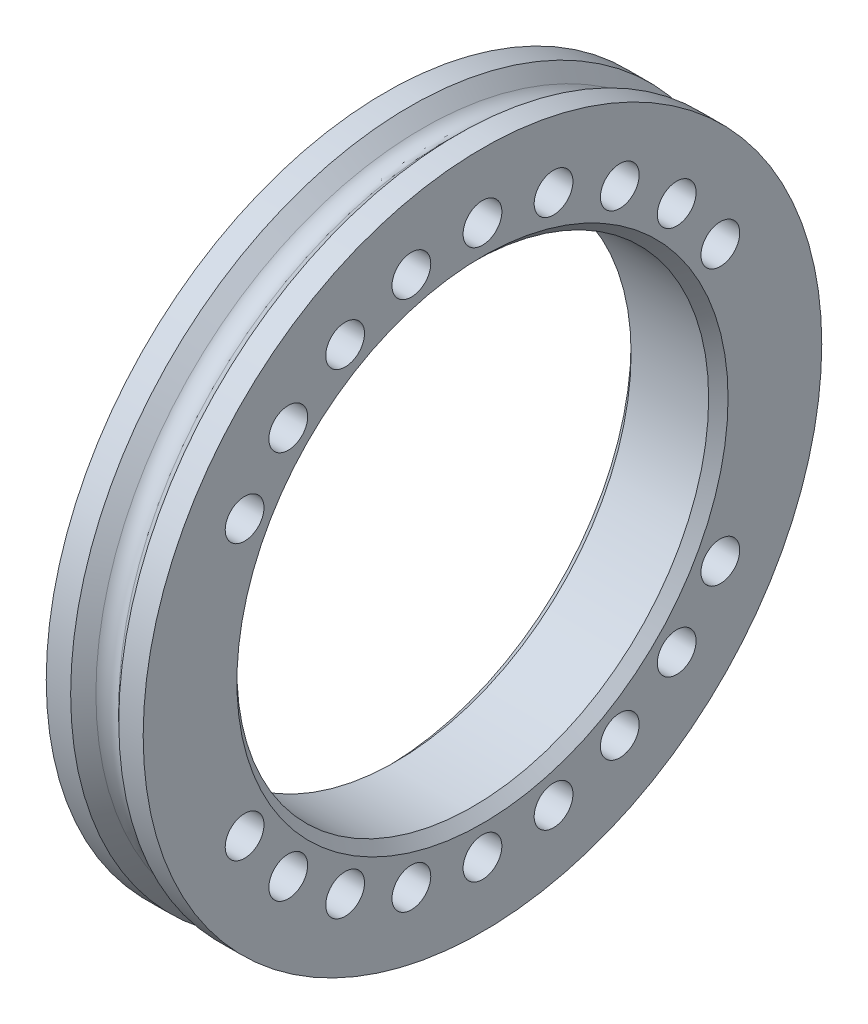
ISO-10303-21;
HEADER;
FILE_DESCRIPTION(('STEP AP214'),'2;1');
FILE_NAME('part.step','',(''),(''),'','','');
FILE_SCHEMA(('AUTOMOTIVE_DESIGN { 1 0 10303 214 1 1 1 1 }'));
ENDSEC;
DATA;
#1=APPLICATION_CONTEXT('core data for automotive mechanical design processes');
#2=APPLICATION_PROTOCOL_DEFINITION('international standard','automotive_design',2000,#1);
#3=PRODUCT_CONTEXT('',#1,'mechanical');
#4=PRODUCT('Part','Part','',(#3));
#5=PRODUCT_RELATED_PRODUCT_CATEGORY('part','',(#4));
#6=PRODUCT_DEFINITION_FORMATION('','',#4);
#7=PRODUCT_DEFINITION_CONTEXT('part definition',#1,'design');
#8=PRODUCT_DEFINITION('design','',#6,#7);
#9=PRODUCT_DEFINITION_SHAPE('','',#8);
#10=(LENGTH_UNIT() NAMED_UNIT(*) SI_UNIT(.MILLI.,.METRE.));
#11=(NAMED_UNIT(*) PLANE_ANGLE_UNIT() SI_UNIT($,.RADIAN.));
#12=(NAMED_UNIT(*) SI_UNIT($,.STERADIAN.) SOLID_ANGLE_UNIT());
#13=UNCERTAINTY_MEASURE_WITH_UNIT(LENGTH_MEASURE(1.E-05),#10,'distance_accuracy_value','');
#14=(GEOMETRIC_REPRESENTATION_CONTEXT(3) GLOBAL_UNCERTAINTY_ASSIGNED_CONTEXT((#13)) GLOBAL_UNIT_ASSIGNED_CONTEXT((#10,
#11,#12)) REPRESENTATION_CONTEXT('',''));
#15=CARTESIAN_POINT('',(0.,0.,0.));
#16=DIRECTION('',(0.,0.,1.));
#17=DIRECTION('',(1.,0.,0.));
#18=AXIS2_PLACEMENT_3D('',#15,#16,#17);
#19=CARTESIAN_POINT('',(-7.4423881554251,0.,0.));
#20=DIRECTION('',(-1.,0.,0.));
#21=DIRECTION('',(0.,0.,1.));
#22=AXIS2_PLACEMENT_3D('',#19,#20,#21);
#23=CONICAL_SURFACE('',#22,105.,0.785398163397449);
#24=CARTESIAN_POINT('',(-3.53553390593271,0.,0.));
#25=DIRECTION('',(1.,0.,0.));
#26=DIRECTION('',(0.,0.,-1.));
#27=AXIS2_PLACEMENT_3D('',#24,#25,#26);
#28=CIRCLE('',#27,101.093145750508);
#29=CARTESIAN_POINT('',(-3.53553390593271,0.,-101.093145750508));
#30=VERTEX_POINT('',#29);
#31=EDGE_CURVE('E39',#30,#30,#28,.F.);
#32=ORIENTED_EDGE('',*,*,#31,.T.);
#33=EDGE_LOOP('',(#32));
#34=FACE_BOUND('',#33,.T.);
#35=CARTESIAN_POINT('',(-7.4423881554251,0.,0.));
#36=DIRECTION('',(-1.,0.,0.));
#37=DIRECTION('',(0.,0.,1.));
#38=AXIS2_PLACEMENT_3D('',#35,#36,#37);
#39=CIRCLE('',#38,105.);
#40=CARTESIAN_POINT('',(-7.4423881554251,0.,105.));
#41=VERTEX_POINT('',#40);
#42=EDGE_CURVE('E58',#41,#41,#39,.T.);
#43=ORIENTED_EDGE('',*,*,#42,.F.);
#44=EDGE_LOOP('',(#43));
#45=FACE_BOUND('',#44,.T.);
#46=ADVANCED_FACE('F32',(#34,#45),#23,.T.);
#47=CARTESIAN_POINT('',(0.,0.,0.));
#48=DIRECTION('',(-1.,0.,0.));
#49=DIRECTION('',(0.,0.,1.));
#50=AXIS2_PLACEMENT_3D('',#47,#48,#49);
#51=CYLINDRICAL_SURFACE('',#50,105.);
#52=CARTESIAN_POINT('',(-15.,0.,0.));
#53=DIRECTION('',(-1.,0.,0.));
#54=DIRECTION('',(0.,0.,1.));
#55=AXIS2_PLACEMENT_3D('',#52,#53,#54);
#56=CIRCLE('',#55,105.);
#57=CARTESIAN_POINT('',(-15.,0.,105.));
#58=VERTEX_POINT('',#57);
#59=EDGE_CURVE('E61',#58,#58,#56,.T.);
#60=ORIENTED_EDGE('',*,*,#59,.F.);
#61=EDGE_LOOP('',(#60));
#62=FACE_BOUND('',#61,.T.);
#63=ORIENTED_EDGE('',*,*,#42,.T.);
#64=EDGE_LOOP('',(#63));
#65=FACE_BOUND('',#64,.T.);
#66=ADVANCED_FACE('F186',(#62,#65),#51,.T.);
#67=CARTESIAN_POINT('',(-15.,0.,0.));
#68=DIRECTION('',(1.,0.,0.));
#69=DIRECTION('',(0.,0.,-1.));
#70=AXIS2_PLACEMENT_3D('',#67,#68,#69);
#71=PLANE('',#70);
#72=CARTESIAN_POINT('',(-15.,-42.4999999999998,73.6121593216774));
#73=DIRECTION('',(-1.,0.,0.));
#74=DIRECTION('',(0.,-0.86602540378444,-0.499999999999998));
#75=AXIS2_PLACEMENT_3D('',#72,#73,#74);
#76=CIRCLE('',#75,6.);
#77=CARTESIAN_POINT('',(-15.,-47.6961524227065,70.6121593216774));
#78=VERTEX_POINT('',#77);
#79=EDGE_CURVE('E134',#78,#78,#76,.T.);
#80=ORIENTED_EDGE('',*,*,#79,.F.);
#81=EDGE_LOOP('',(#80));
#82=FACE_BOUND('',#81,.T.);
#83=CARTESIAN_POINT('',(-15.,-60.1040764008564,60.1040764008567));
#84=DIRECTION('',(-1.,0.,0.));
#85=DIRECTION('',(0.,-0.707106781186549,-0.707106781186546));
#86=AXIS2_PLACEMENT_3D('',#83,#84,#85);
#87=CIRCLE('',#86,6.);
#88=CARTESIAN_POINT('',(-15.,-64.3467170879757,55.8614357137374));
#89=VERTEX_POINT('',#88);
#90=EDGE_CURVE('E140',#89,#89,#87,.T.);
#91=ORIENTED_EDGE('',*,*,#90,.F.);
#92=EDGE_LOOP('',(#91));
#93=FACE_BOUND('',#92,.T.);
#94=CARTESIAN_POINT('',(-15.,-73.6121593216773,42.5000000000001));
#95=DIRECTION('',(-1.,0.,0.));
#96=DIRECTION('',(0.,-0.500000000000001,-0.866025403784438));
#97=AXIS2_PLACEMENT_3D('',#94,#95,#96);
#98=CIRCLE('',#97,6.);
#99=CARTESIAN_POINT('',(-15.,-76.6121593216773,37.3038475772935));
#100=VERTEX_POINT('',#99);
#101=EDGE_CURVE('E146',#100,#100,#98,.T.);
#102=ORIENTED_EDGE('',*,*,#101,.F.);
#103=EDGE_LOOP('',(#102));
#104=FACE_BOUND('',#103,.T.);
#105=CARTESIAN_POINT('',(-15.,-82.1036952345708,21.9996188337143));
#106=DIRECTION('',(-1.,0.,0.));
#107=DIRECTION('',(0.,-0.258819045102521,-0.965925826289068));
#108=AXIS2_PLACEMENT_3D('',#105,#106,#107);
#109=CIRCLE('',#108,6.);
#110=CARTESIAN_POINT('',(-15.,-83.6566095051859,16.2040638759799));
#111=VERTEX_POINT('',#110);
#112=EDGE_CURVE('E152',#111,#111,#109,.T.);
#113=ORIENTED_EDGE('',*,*,#112,.F.);
#114=EDGE_LOOP('',(#113));
#115=FACE_BOUND('',#114,.T.);
#116=CARTESIAN_POINT('',(-15.,-42.4999999999998,-73.6121593216774));
#117=DIRECTION('',(-1.,0.,0.));
#118=DIRECTION('',(0.,0.86602540378444,-0.499999999999998));
#119=AXIS2_PLACEMENT_3D('',#116,#117,#118);
#120=CIRCLE('',#119,6.);
#121=CARTESIAN_POINT('',(-15.,-37.3038475772932,-76.6121593216774));
#122=VERTEX_POINT('',#121);
#123=EDGE_CURVE('E158',#122,#122,#120,.T.);
#124=ORIENTED_EDGE('',*,*,#123,.F.);
#125=EDGE_LOOP('',(#124));
#126=FACE_BOUND('',#125,.T.);
#127=CARTESIAN_POINT('',(-15.,-60.1040764008564,-60.1040764008567));
#128=DIRECTION('',(-1.,0.,0.));
#129=DIRECTION('',(0.,0.707106781186549,-0.707106781186546));
#130=AXIS2_PLACEMENT_3D('',#127,#128,#129);
#131=CIRCLE('',#130,6.);
#132=CARTESIAN_POINT('',(-15.,-55.8614357137372,-64.3467170879759));
#133=VERTEX_POINT('',#132);
#134=EDGE_CURVE('E164',#133,#133,#131,.T.);
#135=ORIENTED_EDGE('',*,*,#134,.F.);
#136=EDGE_LOOP('',(#135));
#137=FACE_BOUND('',#136,.T.);
#138=CARTESIAN_POINT('',(-15.,-73.6121593216773,-42.5000000000001));
#139=DIRECTION('',(-1.,0.,0.));
#140=DIRECTION('',(0.,0.500000000000001,-0.866025403784438));
#141=AXIS2_PLACEMENT_3D('',#138,#139,#140);
#142=CIRCLE('',#141,6.);
#143=CARTESIAN_POINT('',(-15.,-70.6121593216773,-47.6961524227067));
#144=VERTEX_POINT('',#143);
#145=EDGE_CURVE('E170',#144,#144,#142,.T.);
#146=ORIENTED_EDGE('',*,*,#145,.F.);
#147=EDGE_LOOP('',(#146));
#148=FACE_BOUND('',#147,.T.);
#149=CARTESIAN_POINT('',(-15.,-82.1036952345708,-21.9996188337143));
#150=DIRECTION('',(-1.,0.,0.));
#151=DIRECTION('',(0.,0.258819045102521,-0.965925826289068));
#152=AXIS2_PLACEMENT_3D('',#149,#150,#151);
#153=CIRCLE('',#152,6.);
#154=CARTESIAN_POINT('',(-15.,-80.5507809639557,-27.7951737914487));
#155=VERTEX_POINT('',#154);
#156=EDGE_CURVE('E128',#155,#155,#153,.T.);
#157=ORIENTED_EDGE('',*,*,#156,.F.);
#158=EDGE_LOOP('',(#157));
#159=FACE_BOUND('',#158,.T.);
#160=CARTESIAN_POINT('',(-15.,-85.,0.));
#161=DIRECTION('',(-1.,0.,0.));
#162=DIRECTION('',(0.,0.,-1.));
#163=AXIS2_PLACEMENT_3D('',#160,#161,#162);
#164=CIRCLE('',#163,6.);
#165=CARTESIAN_POINT('',(-15.,-85.,-6.));
#166=VERTEX_POINT('',#165);
#167=EDGE_CURVE('E87',#166,#166,#164,.T.);
#168=ORIENTED_EDGE('',*,*,#167,.F.);
#169=EDGE_LOOP('',(#168));
#170=FACE_BOUND('',#169,.T.);
#171=CARTESIAN_POINT('',(-15.,42.4999999999998,73.6121593216774));
#172=DIRECTION('',(1.,0.,0.));
#173=DIRECTION('',(0.,0.86602540378444,-0.499999999999998));
#174=AXIS2_PLACEMENT_3D('',#171,#172,#173);
#175=CIRCLE('',#174,6.);
#176=CARTESIAN_POINT('',(-15.,47.6961524227065,70.6121593216774));
#177=VERTEX_POINT('',#176);
#178=EDGE_CURVE('E86',#177,#177,#175,.T.);
#179=ORIENTED_EDGE('',*,*,#178,.T.);
#180=EDGE_LOOP('',(#179));
#181=FACE_BOUND('',#180,.T.);
#182=CARTESIAN_POINT('',(-15.,60.1040764008564,60.1040764008567));
#183=DIRECTION('',(1.,0.,0.));
#184=DIRECTION('',(0.,0.707106781186549,-0.707106781186546));
#185=AXIS2_PLACEMENT_3D('',#182,#183,#184);
#186=CIRCLE('',#185,6.);
#187=CARTESIAN_POINT('',(-15.,64.3467170879757,55.8614357137374));
#188=VERTEX_POINT('',#187);
#189=EDGE_CURVE('E93',#188,#188,#186,.T.);
#190=ORIENTED_EDGE('',*,*,#189,.T.);
#191=EDGE_LOOP('',(#190));
#192=FACE_BOUND('',#191,.T.);
#193=CARTESIAN_POINT('',(-15.,73.6121593216773,42.5000000000001));
#194=DIRECTION('',(1.,0.,0.));
#195=DIRECTION('',(0.,0.500000000000001,-0.866025403784438));
#196=AXIS2_PLACEMENT_3D('',#193,#194,#195);
#197=CIRCLE('',#196,6.);
#198=CARTESIAN_POINT('',(-15.,76.6121593216773,37.3038475772935));
#199=VERTEX_POINT('',#198);
#200=EDGE_CURVE('E99',#199,#199,#197,.T.);
#201=ORIENTED_EDGE('',*,*,#200,.T.);
#202=EDGE_LOOP('',(#201));
#203=FACE_BOUND('',#202,.T.);
#204=CARTESIAN_POINT('',(-15.,73.6121593216773,-42.5000000000001));
#205=DIRECTION('',(1.,0.,0.));
#206=DIRECTION('',(0.,-0.500000000000001,-0.866025403784438));
#207=AXIS2_PLACEMENT_3D('',#204,#205,#206);
#208=CIRCLE('',#207,6.);
#209=CARTESIAN_POINT('',(-15.,70.6121593216773,-47.6961524227067));
#210=VERTEX_POINT('',#209);
#211=EDGE_CURVE('E80',#210,#210,#208,.T.);
#212=ORIENTED_EDGE('',*,*,#211,.T.);
#213=EDGE_LOOP('',(#212));
#214=FACE_BOUND('',#213,.T.);
#215=CARTESIAN_POINT('',(-15.,60.1040764008564,-60.1040764008567));
#216=DIRECTION('',(1.,0.,0.));
#217=DIRECTION('',(0.,-0.707106781186549,-0.707106781186546));
#218=AXIS2_PLACEMENT_3D('',#215,#216,#217);
#219=CIRCLE('',#218,6.);
#220=CARTESIAN_POINT('',(-15.,55.8614357137372,-64.3467170879759));
#221=VERTEX_POINT('',#220);
#222=EDGE_CURVE('E106',#221,#221,#219,.T.);
#223=ORIENTED_EDGE('',*,*,#222,.T.);
#224=EDGE_LOOP('',(#223));
#225=FACE_BOUND('',#224,.T.);
#226=CARTESIAN_POINT('',(-15.,42.4999999999998,-73.6121593216774));
#227=DIRECTION('',(1.,0.,0.));
#228=DIRECTION('',(0.,-0.86602540378444,-0.499999999999998));
#229=AXIS2_PLACEMENT_3D('',#226,#227,#228);
#230=CIRCLE('',#229,6.);
#231=CARTESIAN_POINT('',(-15.,37.3038475772932,-76.6121593216774));
#232=VERTEX_POINT('',#231);
#233=EDGE_CURVE('E107',#232,#232,#230,.T.);
#234=ORIENTED_EDGE('',*,*,#233,.T.);
#235=EDGE_LOOP('',(#234));
#236=FACE_BOUND('',#235,.T.);
#237=CARTESIAN_POINT('',(-15.,82.1036952345708,21.9996188337143));
#238=DIRECTION('',(1.,0.,0.));
#239=DIRECTION('',(0.,0.258819045102521,-0.965925826289068));
#240=AXIS2_PLACEMENT_3D('',#237,#238,#239);
#241=CIRCLE('',#240,6.);
#242=CARTESIAN_POINT('',(-15.,83.6566095051859,16.2040638759799));
#243=VERTEX_POINT('',#242);
#244=EDGE_CURVE('E117',#243,#243,#241,.T.);
#245=ORIENTED_EDGE('',*,*,#244,.T.);
#246=EDGE_LOOP('',(#245));
#247=FACE_BOUND('',#246,.T.);
#248=CARTESIAN_POINT('',(-15.,82.1036952345708,-21.9996188337143));
#249=DIRECTION('',(1.,0.,0.));
#250=DIRECTION('',(0.,-0.258819045102521,-0.965925826289068));
#251=AXIS2_PLACEMENT_3D('',#248,#249,#250);
#252=CIRCLE('',#251,6.);
#253=CARTESIAN_POINT('',(-15.,80.5507809639557,-27.7951737914487));
#254=VERTEX_POINT('',#253);
#255=EDGE_CURVE('E74',#254,#254,#252,.T.);
#256=ORIENTED_EDGE('',*,*,#255,.T.);
#257=EDGE_LOOP('',(#256));
#258=FACE_BOUND('',#257,.T.);
#259=CARTESIAN_POINT('',(-15.,85.,0.));
#260=DIRECTION('',(1.,0.,0.));
#261=DIRECTION('',(0.,0.,-1.));
#262=AXIS2_PLACEMENT_3D('',#259,#260,#261);
#263=CIRCLE('',#262,6.);
#264=CARTESIAN_POINT('',(-15.,85.,-6.));
#265=VERTEX_POINT('',#264);
#266=EDGE_CURVE('E70',#265,#265,#263,.T.);
#267=ORIENTED_EDGE('',*,*,#266,.T.);
#268=EDGE_LOOP('',(#267));
#269=FACE_BOUND('',#268,.T.);
#270=CARTESIAN_POINT('',(-15.,0.,0.));
#271=DIRECTION('',(1.,0.,0.));
#272=DIRECTION('',(0.,0.,-1.));
#273=AXIS2_PLACEMENT_3D('',#270,#271,#272);
#274=CIRCLE('',#273,76.);
#275=CARTESIAN_POINT('',(-15.,0.,-76.));
#276=VERTEX_POINT('',#275);
#277=EDGE_CURVE('E43',#276,#276,#274,.T.);
#278=ORIENTED_EDGE('',*,*,#277,.T.);
#279=EDGE_LOOP('',(#278));
#280=FACE_BOUND('',#279,.T.);
#281=ORIENTED_EDGE('',*,*,#59,.T.);
#282=EDGE_LOOP('',(#281));
#283=FACE_BOUND('',#282,.T.);
#284=ADVANCED_FACE('F182',(#82,#93,#104,#115,#126,#137,#148,#159,#170,#181,#192,#203,#214,#225,
#236,#247,#258,#269,#280,#283),#71,.F.);
#285=CARTESIAN_POINT('',(0.,0.,0.));
#286=DIRECTION('',(-1.,0.,0.));
#287=DIRECTION('',(0.,0.,1.));
#288=AXIS2_PLACEMENT_3D('',#285,#286,#287);
#289=CYLINDRICAL_SURFACE('',#288,73.);
#290=CARTESIAN_POINT('',(12.,0.,0.));
#291=DIRECTION('',(1.,0.,0.));
#292=DIRECTION('',(0.,0.,-1.));
#293=AXIS2_PLACEMENT_3D('',#290,#291,#292);
#294=CIRCLE('',#293,73.);
#295=CARTESIAN_POINT('',(12.,0.,-73.));
#296=VERTEX_POINT('',#295);
#297=EDGE_CURVE('E47',#296,#296,#294,.T.);
#298=ORIENTED_EDGE('',*,*,#297,.T.);
#299=EDGE_LOOP('',(#298));
#300=FACE_BOUND('',#299,.T.);
#301=CARTESIAN_POINT('',(-11.9999999999999,0.,0.));
#302=DIRECTION('',(1.,0.,0.));
#303=DIRECTION('',(0.,0.,-1.));
#304=AXIS2_PLACEMENT_3D('',#301,#302,#303);
#305=CIRCLE('',#304,73.);
#306=CARTESIAN_POINT('',(-11.9999999999999,0.,-73.));
#307=VERTEX_POINT('',#306);
#308=EDGE_CURVE('E52',#307,#307,#305,.F.);
#309=ORIENTED_EDGE('',*,*,#308,.T.);
#310=EDGE_LOOP('',(#309));
#311=FACE_BOUND('',#310,.T.);
#312=ADVANCED_FACE('F185',(#300,#311),#289,.F.);
#313=CARTESIAN_POINT('',(15.,0.,0.));
#314=DIRECTION('',(1.,0.,0.));
#315=DIRECTION('',(0.,0.,-1.));
#316=AXIS2_PLACEMENT_3D('',#313,#314,#315);
#317=PLANE('',#316);
#318=CARTESIAN_POINT('',(15.,-42.4999999999998,73.6121593216774));
#319=DIRECTION('',(-1.,0.,0.));
#320=DIRECTION('',(0.,-0.86602540378444,-0.499999999999998));
#321=AXIS2_PLACEMENT_3D('',#318,#319,#320);
#322=CIRCLE('',#321,6.);
#323=CARTESIAN_POINT('',(15.,-47.6961524227065,70.6121593216774));
#324=VERTEX_POINT('',#323);
#325=EDGE_CURVE('E131',#324,#324,#322,.T.);
#326=ORIENTED_EDGE('',*,*,#325,.T.);
#327=EDGE_LOOP('',(#326));
#328=FACE_BOUND('',#327,.T.);
#329=CARTESIAN_POINT('',(15.,-60.1040764008564,60.1040764008567));
#330=DIRECTION('',(-1.,0.,0.));
#331=DIRECTION('',(0.,-0.707106781186549,-0.707106781186546));
#332=AXIS2_PLACEMENT_3D('',#329,#330,#331);
#333=CIRCLE('',#332,6.);
#334=CARTESIAN_POINT('',(15.,-64.3467170879757,55.8614357137374));
#335=VERTEX_POINT('',#334);
#336=EDGE_CURVE('E137',#335,#335,#333,.T.);
#337=ORIENTED_EDGE('',*,*,#336,.T.);
#338=EDGE_LOOP('',(#337));
#339=FACE_BOUND('',#338,.T.);
#340=CARTESIAN_POINT('',(15.,-73.6121593216773,42.5000000000001));
#341=DIRECTION('',(-1.,0.,0.));
#342=DIRECTION('',(0.,-0.500000000000001,-0.866025403784438));
#343=AXIS2_PLACEMENT_3D('',#340,#341,#342);
#344=CIRCLE('',#343,6.);
#345=CARTESIAN_POINT('',(15.,-76.6121593216773,37.3038475772935));
#346=VERTEX_POINT('',#345);
#347=EDGE_CURVE('E143',#346,#346,#344,.T.);
#348=ORIENTED_EDGE('',*,*,#347,.T.);
#349=EDGE_LOOP('',(#348));
#350=FACE_BOUND('',#349,.T.);
#351=CARTESIAN_POINT('',(15.,-82.1036952345708,21.9996188337143));
#352=DIRECTION('',(-1.,0.,0.));
#353=DIRECTION('',(0.,-0.258819045102521,-0.965925826289068));
#354=AXIS2_PLACEMENT_3D('',#351,#352,#353);
#355=CIRCLE('',#354,6.);
#356=CARTESIAN_POINT('',(15.,-83.6566095051859,16.2040638759799));
#357=VERTEX_POINT('',#356);
#358=EDGE_CURVE('E149',#357,#357,#355,.T.);
#359=ORIENTED_EDGE('',*,*,#358,.T.);
#360=EDGE_LOOP('',(#359));
#361=FACE_BOUND('',#360,.T.);
#362=CARTESIAN_POINT('',(15.,-42.4999999999998,-73.6121593216774));
#363=DIRECTION('',(-1.,0.,0.));
#364=DIRECTION('',(0.,0.86602540378444,-0.499999999999998));
#365=AXIS2_PLACEMENT_3D('',#362,#363,#364);
#366=CIRCLE('',#365,6.);
#367=CARTESIAN_POINT('',(15.,-37.3038475772932,-76.6121593216774));
#368=VERTEX_POINT('',#367);
#369=EDGE_CURVE('E155',#368,#368,#366,.T.);
#370=ORIENTED_EDGE('',*,*,#369,.T.);
#371=EDGE_LOOP('',(#370));
#372=FACE_BOUND('',#371,.T.);
#373=CARTESIAN_POINT('',(15.,-60.1040764008564,-60.1040764008567));
#374=DIRECTION('',(-1.,0.,0.));
#375=DIRECTION('',(0.,0.707106781186549,-0.707106781186546));
#376=AXIS2_PLACEMENT_3D('',#373,#374,#375);
#377=CIRCLE('',#376,6.);
#378=CARTESIAN_POINT('',(15.,-55.8614357137372,-64.3467170879759));
#379=VERTEX_POINT('',#378);
#380=EDGE_CURVE('E161',#379,#379,#377,.T.);
#381=ORIENTED_EDGE('',*,*,#380,.T.);
#382=EDGE_LOOP('',(#381));
#383=FACE_BOUND('',#382,.T.);
#384=CARTESIAN_POINT('',(15.,-73.6121593216773,-42.5000000000001));
#385=DIRECTION('',(-1.,0.,0.));
#386=DIRECTION('',(0.,0.500000000000001,-0.866025403784438));
#387=AXIS2_PLACEMENT_3D('',#384,#385,#386);
#388=CIRCLE('',#387,6.);
#389=CARTESIAN_POINT('',(15.,-70.6121593216773,-47.6961524227067));
#390=VERTEX_POINT('',#389);
#391=EDGE_CURVE('E167',#390,#390,#388,.T.);
#392=ORIENTED_EDGE('',*,*,#391,.T.);
#393=EDGE_LOOP('',(#392));
#394=FACE_BOUND('',#393,.T.);
#395=CARTESIAN_POINT('',(15.,-82.1036952345708,-21.9996188337143));
#396=DIRECTION('',(-1.,0.,0.));
#397=DIRECTION('',(0.,0.258819045102521,-0.965925826289068));
#398=AXIS2_PLACEMENT_3D('',#395,#396,#397);
#399=CIRCLE('',#398,6.);
#400=CARTESIAN_POINT('',(15.,-80.5507809639557,-27.7951737914487));
#401=VERTEX_POINT('',#400);
#402=EDGE_CURVE('E173',#401,#401,#399,.T.);
#403=ORIENTED_EDGE('',*,*,#402,.T.);
#404=EDGE_LOOP('',(#403));
#405=FACE_BOUND('',#404,.T.);
#406=CARTESIAN_POINT('',(15.,-85.,0.));
#407=DIRECTION('',(-1.,0.,0.));
#408=DIRECTION('',(0.,0.,-1.));
#409=AXIS2_PLACEMENT_3D('',#406,#407,#408);
#410=CIRCLE('',#409,6.);
#411=CARTESIAN_POINT('',(15.,-85.,-6.));
#412=VERTEX_POINT('',#411);
#413=EDGE_CURVE('E125',#412,#412,#410,.T.);
#414=ORIENTED_EDGE('',*,*,#413,.T.);
#415=EDGE_LOOP('',(#414));
#416=FACE_BOUND('',#415,.T.);
#417=CARTESIAN_POINT('',(15.,42.4999999999998,73.6121593216774));
#418=DIRECTION('',(1.,0.,0.));
#419=DIRECTION('',(0.,0.86602540378444,-0.499999999999998));
#420=AXIS2_PLACEMENT_3D('',#417,#418,#419);
#421=CIRCLE('',#420,6.);
#422=CARTESIAN_POINT('',(15.,47.6961524227065,70.6121593216774));
#423=VERTEX_POINT('',#422);
#424=EDGE_CURVE('E83',#423,#423,#421,.T.);
#425=ORIENTED_EDGE('',*,*,#424,.F.);
#426=EDGE_LOOP('',(#425));
#427=FACE_BOUND('',#426,.T.);
#428=CARTESIAN_POINT('',(15.,60.1040764008564,60.1040764008567));
#429=DIRECTION('',(1.,0.,0.));
#430=DIRECTION('',(0.,0.707106781186549,-0.707106781186546));
#431=AXIS2_PLACEMENT_3D('',#428,#429,#430);
#432=CIRCLE('',#431,6.);
#433=CARTESIAN_POINT('',(15.,64.3467170879757,55.8614357137374));
#434=VERTEX_POINT('',#433);
#435=EDGE_CURVE('E90',#434,#434,#432,.T.);
#436=ORIENTED_EDGE('',*,*,#435,.F.);
#437=EDGE_LOOP('',(#436));
#438=FACE_BOUND('',#437,.T.);
#439=CARTESIAN_POINT('',(15.,73.6121593216773,42.5000000000001));
#440=DIRECTION('',(1.,0.,0.));
#441=DIRECTION('',(0.,0.500000000000001,-0.866025403784438));
#442=AXIS2_PLACEMENT_3D('',#439,#440,#441);
#443=CIRCLE('',#442,6.);
#444=CARTESIAN_POINT('',(15.,76.6121593216773,37.3038475772935));
#445=VERTEX_POINT('',#444);
#446=EDGE_CURVE('E96',#445,#445,#443,.T.);
#447=ORIENTED_EDGE('',*,*,#446,.F.);
#448=EDGE_LOOP('',(#447));
#449=FACE_BOUND('',#448,.T.);
#450=CARTESIAN_POINT('',(15.,73.6121593216773,-42.5000000000001));
#451=DIRECTION('',(1.,0.,0.));
#452=DIRECTION('',(0.,-0.500000000000001,-0.866025403784438));
#453=AXIS2_PLACEMENT_3D('',#450,#451,#452);
#454=CIRCLE('',#453,6.);
#455=CARTESIAN_POINT('',(15.,70.6121593216773,-47.6961524227067));
#456=VERTEX_POINT('',#455);
#457=EDGE_CURVE('E110',#456,#456,#454,.T.);
#458=ORIENTED_EDGE('',*,*,#457,.F.);
#459=EDGE_LOOP('',(#458));
#460=FACE_BOUND('',#459,.T.);
#461=CARTESIAN_POINT('',(15.,60.1040764008564,-60.1040764008567));
#462=DIRECTION('',(1.,0.,0.));
#463=DIRECTION('',(0.,-0.707106781186549,-0.707106781186546));
#464=AXIS2_PLACEMENT_3D('',#461,#462,#463);
#465=CIRCLE('',#464,6.);
#466=CARTESIAN_POINT('',(15.,55.8614357137372,-64.3467170879759));
#467=VERTEX_POINT('',#466);
#468=EDGE_CURVE('E103',#467,#467,#465,.T.);
#469=ORIENTED_EDGE('',*,*,#468,.F.);
#470=EDGE_LOOP('',(#469));
#471=FACE_BOUND('',#470,.T.);
#472=CARTESIAN_POINT('',(15.,42.4999999999998,-73.6121593216774));
#473=DIRECTION('',(1.,0.,0.));
#474=DIRECTION('',(0.,-0.86602540378444,-0.499999999999998));
#475=AXIS2_PLACEMENT_3D('',#472,#473,#474);
#476=CIRCLE('',#475,6.);
#477=CARTESIAN_POINT('',(15.,37.3038475772932,-76.6121593216774));
#478=VERTEX_POINT('',#477);
#479=EDGE_CURVE('E120',#478,#478,#476,.T.);
#480=ORIENTED_EDGE('',*,*,#479,.F.);
#481=EDGE_LOOP('',(#480));
#482=FACE_BOUND('',#481,.T.);
#483=CARTESIAN_POINT('',(15.,82.1036952345708,21.9996188337143));
#484=DIRECTION('',(1.,0.,0.));
#485=DIRECTION('',(0.,0.258819045102521,-0.965925826289068));
#486=AXIS2_PLACEMENT_3D('',#483,#484,#485);
#487=CIRCLE('',#486,6.);
#488=CARTESIAN_POINT('',(15.,83.6566095051859,16.2040638759799));
#489=VERTEX_POINT('',#488);
#490=EDGE_CURVE('E102',#489,#489,#487,.T.);
#491=ORIENTED_EDGE('',*,*,#490,.F.);
#492=EDGE_LOOP('',(#491));
#493=FACE_BOUND('',#492,.T.);
#494=CARTESIAN_POINT('',(15.,82.1036952345708,-21.9996188337143));
#495=DIRECTION('',(1.,0.,0.));
#496=DIRECTION('',(0.,-0.258819045102521,-0.965925826289068));
#497=AXIS2_PLACEMENT_3D('',#494,#495,#496);
#498=CIRCLE('',#497,6.);
#499=CARTESIAN_POINT('',(15.,80.5507809639557,-27.7951737914487));
#500=VERTEX_POINT('',#499);
#501=EDGE_CURVE('E77',#500,#500,#498,.T.);
#502=ORIENTED_EDGE('',*,*,#501,.F.);
#503=EDGE_LOOP('',(#502));
#504=FACE_BOUND('',#503,.T.);
#505=CARTESIAN_POINT('',(15.,85.,0.));
#506=DIRECTION('',(1.,0.,0.));
#507=DIRECTION('',(0.,0.,-1.));
#508=AXIS2_PLACEMENT_3D('',#505,#506,#507);
#509=CIRCLE('',#508,6.);
#510=CARTESIAN_POINT('',(15.,85.,-6.));
#511=VERTEX_POINT('',#510);
#512=EDGE_CURVE('E71',#511,#511,#509,.T.);
#513=ORIENTED_EDGE('',*,*,#512,.F.);
#514=EDGE_LOOP('',(#513));
#515=FACE_BOUND('',#514,.T.);
#516=CARTESIAN_POINT('',(15.,0.,0.));
#517=DIRECTION('',(1.,0.,0.));
#518=DIRECTION('',(0.,0.,-1.));
#519=AXIS2_PLACEMENT_3D('',#516,#517,#518);
#520=CIRCLE('',#519,76.);
#521=CARTESIAN_POINT('',(15.,0.,-76.));
#522=VERTEX_POINT('',#521);
#523=EDGE_CURVE('E55',#522,#522,#520,.F.);
#524=ORIENTED_EDGE('',*,*,#523,.T.);
#525=EDGE_LOOP('',(#524));
#526=FACE_BOUND('',#525,.T.);
#527=CARTESIAN_POINT('',(15.,0.,0.));
#528=DIRECTION('',(-1.,0.,0.));
#529=DIRECTION('',(0.,0.,1.));
#530=AXIS2_PLACEMENT_3D('',#527,#528,#529);
#531=CIRCLE('',#530,105.);
#532=CARTESIAN_POINT('',(15.,0.,105.));
#533=VERTEX_POINT('',#532);
#534=EDGE_CURVE('E64',#533,#533,#531,.T.);
#535=ORIENTED_EDGE('',*,*,#534,.F.);
#536=EDGE_LOOP('',(#535));
#537=FACE_BOUND('',#536,.T.);
#538=ADVANCED_FACE('F241',(#328,#339,#350,#361,#372,#383,#394,#405,#416,#427,#438,#449,#460,
#471,#482,#493,#504,#515,#526,#537),#317,.T.);
#539=CARTESIAN_POINT('',(7.44238815542515,0.,0.));
#540=DIRECTION('',(-1.,0.,0.));
#541=DIRECTION('',(0.,0.,1.));
#542=AXIS2_PLACEMENT_3D('',#539,#540,#541);
#543=CIRCLE('',#542,105.);
#544=CARTESIAN_POINT('',(7.44238815542515,0.,105.));
#545=VERTEX_POINT('',#544);
#546=EDGE_CURVE('E67',#545,#545,#543,.T.);
#547=ORIENTED_EDGE('',*,*,#546,.F.);
#548=EDGE_LOOP('',(#547));
#549=FACE_BOUND('',#548,.T.);
#550=ORIENTED_EDGE('',*,*,#534,.T.);
#551=EDGE_LOOP('',(#550));
#552=FACE_BOUND('',#551,.T.);
#553=ADVANCED_FACE('F216',(#549,#552),#51,.T.);
#554=CARTESIAN_POINT('',(7.44238815542515,0.,0.));
#555=DIRECTION('',(1.,0.,0.));
#556=DIRECTION('',(0.,0.,-1.));
#557=AXIS2_PLACEMENT_3D('',#554,#555,#556);
#558=CONICAL_SURFACE('',#557,105.,0.785398163397447);
#559=CARTESIAN_POINT('',(3.53553390593275,0.,0.));
#560=DIRECTION('',(-1.,0.,0.));
#561=DIRECTION('',(0.,0.,1.));
#562=AXIS2_PLACEMENT_3D('',#559,#560,#561);
#563=CIRCLE('',#562,101.093145750508);
#564=CARTESIAN_POINT('',(3.53553390593275,0.,101.093145750508));
#565=VERTEX_POINT('',#564);
#566=EDGE_CURVE('E10',#565,#565,#563,.F.);
#567=ORIENTED_EDGE('',*,*,#566,.T.);
#568=EDGE_LOOP('',(#567));
#569=FACE_BOUND('',#568,.T.);
#570=ORIENTED_EDGE('',*,*,#546,.T.);
#571=EDGE_LOOP('',(#570));
#572=FACE_BOUND('',#571,.T.);
#573=ADVANCED_FACE('F228',(#569,#572),#558,.T.);
#574=CARTESIAN_POINT('',(15.,0.,0.));
#575=DIRECTION('',(1.,0.,0.));
#576=DIRECTION('',(0.,0.,-1.));
#577=AXIS2_PLACEMENT_3D('',#574,#575,#576);
#578=CONICAL_SURFACE('',#577,76.,0.785398163397441);
#579=ORIENTED_EDGE('',*,*,#297,.F.);
#580=EDGE_LOOP('',(#579));
#581=FACE_BOUND('',#580,.T.);
#582=ORIENTED_EDGE('',*,*,#523,.F.);
#583=EDGE_LOOP('',(#582));
#584=FACE_BOUND('',#583,.T.);
#585=ADVANCED_FACE('F225',(#581,#584),#578,.F.);
#586=CARTESIAN_POINT('',(-11.9999999999999,0.,0.));
#587=DIRECTION('',(-1.,0.,0.));
#588=DIRECTION('',(0.,0.,1.));
#589=AXIS2_PLACEMENT_3D('',#586,#587,#588);
#590=CONICAL_SURFACE('',#589,73.,0.785398163397448);
#591=ORIENTED_EDGE('',*,*,#277,.F.);
#592=EDGE_LOOP('',(#591));
#593=FACE_BOUND('',#592,.T.);
#594=ORIENTED_EDGE('',*,*,#308,.F.);
#595=EDGE_LOOP('',(#594));
#596=FACE_BOUND('',#595,.T.);
#597=ADVANCED_FACE('F227',(#593,#596),#590,.F.);
#598=CARTESIAN_POINT('',(0.,0.,0.));
#599=DIRECTION('',(-1.,0.,0.));
#600=DIRECTION('',(0.,0.,1.));
#601=AXIS2_PLACEMENT_3D('',#598,#599,#600);
#602=TOROIDAL_SURFACE('',#601,104.62867965644,5.);
#603=ORIENTED_EDGE('',*,*,#566,.F.);
#604=EDGE_LOOP('',(#603));
#605=FACE_BOUND('',#604,.T.);
#606=ORIENTED_EDGE('',*,*,#31,.F.);
#607=EDGE_LOOP('',(#606));
#608=FACE_BOUND('',#607,.T.);
#609=ADVANCED_FACE('F34',(#605,#608),#602,.F.);
#610=CARTESIAN_POINT('',(-15.,85.,0.));
#611=DIRECTION('',(1.,0.,0.));
#612=DIRECTION('',(0.,0.,-1.));
#613=AXIS2_PLACEMENT_3D('',#610,#611,#612);
#614=CYLINDRICAL_SURFACE('',#613,6.);
#615=ORIENTED_EDGE('',*,*,#266,.F.);
#616=EDGE_LOOP('',(#615));
#617=FACE_BOUND('',#616,.T.);
#618=ORIENTED_EDGE('',*,*,#512,.T.);
#619=EDGE_LOOP('',(#618));
#620=FACE_BOUND('',#619,.T.);
#621=ADVANCED_FACE('F235',(#617,#620),#614,.F.);
#622=CARTESIAN_POINT('',(-15.,82.1036952345708,-21.9996188337143));
#623=DIRECTION('',(1.,0.,0.));
#624=DIRECTION('',(0.,0.,-1.));
#625=AXIS2_PLACEMENT_3D('',#622,#623,#624);
#626=CYLINDRICAL_SURFACE('',#625,6.);
#627=ORIENTED_EDGE('',*,*,#255,.F.);
#628=EDGE_LOOP('',(#627));
#629=FACE_BOUND('',#628,.T.);
#630=ORIENTED_EDGE('',*,*,#501,.T.);
#631=EDGE_LOOP('',(#630));
#632=FACE_BOUND('',#631,.T.);
#633=ADVANCED_FACE('F255',(#629,#632),#626,.F.);
#634=CARTESIAN_POINT('',(-15.,82.1036952345708,21.9996188337143));
#635=DIRECTION('',(1.,0.,0.));
#636=DIRECTION('',(0.,0.,-1.));
#637=AXIS2_PLACEMENT_3D('',#634,#635,#636);
#638=CYLINDRICAL_SURFACE('',#637,6.);
#639=ORIENTED_EDGE('',*,*,#244,.F.);
#640=EDGE_LOOP('',(#639));
#641=FACE_BOUND('',#640,.T.);
#642=ORIENTED_EDGE('',*,*,#490,.T.);
#643=EDGE_LOOP('',(#642));
#644=FACE_BOUND('',#643,.T.);
#645=ADVANCED_FACE('F259',(#641,#644),#638,.F.);
#646=CARTESIAN_POINT('',(-15.,42.4999999999998,-73.6121593216774));
#647=DIRECTION('',(1.,0.,0.));
#648=DIRECTION('',(0.,0.,-1.));
#649=AXIS2_PLACEMENT_3D('',#646,#647,#648);
#650=CYLINDRICAL_SURFACE('',#649,6.);
#651=ORIENTED_EDGE('',*,*,#233,.F.);
#652=EDGE_LOOP('',(#651));
#653=FACE_BOUND('',#652,.T.);
#654=ORIENTED_EDGE('',*,*,#479,.T.);
#655=EDGE_LOOP('',(#654));
#656=FACE_BOUND('',#655,.T.);
#657=ADVANCED_FACE('F278',(#653,#656),#650,.F.);
#658=CARTESIAN_POINT('',(-15.,60.1040764008564,-60.1040764008567));
#659=DIRECTION('',(1.,0.,0.));
#660=DIRECTION('',(0.,0.,-1.));
#661=AXIS2_PLACEMENT_3D('',#658,#659,#660);
#662=CYLINDRICAL_SURFACE('',#661,6.);
#663=ORIENTED_EDGE('',*,*,#222,.F.);
#664=EDGE_LOOP('',(#663));
#665=FACE_BOUND('',#664,.T.);
#666=ORIENTED_EDGE('',*,*,#468,.T.);
#667=EDGE_LOOP('',(#666));
#668=FACE_BOUND('',#667,.T.);
#669=ADVANCED_FACE('F275',(#665,#668),#662,.F.);
#670=CARTESIAN_POINT('',(-15.,73.6121593216773,-42.5000000000001));
#671=DIRECTION('',(1.,0.,0.));
#672=DIRECTION('',(0.,0.,-1.));
#673=AXIS2_PLACEMENT_3D('',#670,#671,#672);
#674=CYLINDRICAL_SURFACE('',#673,6.);
#675=ORIENTED_EDGE('',*,*,#211,.F.);
#676=EDGE_LOOP('',(#675));
#677=FACE_BOUND('',#676,.T.);
#678=ORIENTED_EDGE('',*,*,#457,.T.);
#679=EDGE_LOOP('',(#678));
#680=FACE_BOUND('',#679,.T.);
#681=ADVANCED_FACE('F273',(#677,#680),#674,.F.);
#682=CARTESIAN_POINT('',(-15.,73.6121593216773,42.5000000000001));
#683=DIRECTION('',(1.,0.,0.));
#684=DIRECTION('',(0.,0.,-1.));
#685=AXIS2_PLACEMENT_3D('',#682,#683,#684);
#686=CYLINDRICAL_SURFACE('',#685,6.);
#687=ORIENTED_EDGE('',*,*,#200,.F.);
#688=EDGE_LOOP('',(#687));
#689=FACE_BOUND('',#688,.T.);
#690=ORIENTED_EDGE('',*,*,#446,.T.);
#691=EDGE_LOOP('',(#690));
#692=FACE_BOUND('',#691,.T.);
#693=ADVANCED_FACE('F269',(#689,#692),#686,.F.);
#694=CARTESIAN_POINT('',(-15.,60.1040764008564,60.1040764008567));
#695=DIRECTION('',(1.,0.,0.));
#696=DIRECTION('',(0.,0.,-1.));
#697=AXIS2_PLACEMENT_3D('',#694,#695,#696);
#698=CYLINDRICAL_SURFACE('',#697,6.);
#699=ORIENTED_EDGE('',*,*,#189,.F.);
#700=EDGE_LOOP('',(#699));
#701=FACE_BOUND('',#700,.T.);
#702=ORIENTED_EDGE('',*,*,#435,.T.);
#703=EDGE_LOOP('',(#702));
#704=FACE_BOUND('',#703,.T.);
#705=ADVANCED_FACE('F265',(#701,#704),#698,.F.);
#706=CARTESIAN_POINT('',(-15.,42.4999999999998,73.6121593216774));
#707=DIRECTION('',(1.,0.,0.));
#708=DIRECTION('',(0.,0.,-1.));
#709=AXIS2_PLACEMENT_3D('',#706,#707,#708);
#710=CYLINDRICAL_SURFACE('',#709,6.);
#711=ORIENTED_EDGE('',*,*,#178,.F.);
#712=EDGE_LOOP('',(#711));
#713=FACE_BOUND('',#712,.T.);
#714=ORIENTED_EDGE('',*,*,#424,.T.);
#715=EDGE_LOOP('',(#714));
#716=FACE_BOUND('',#715,.T.);
#717=ADVANCED_FACE('F261',(#713,#716),#710,.F.);
#718=CARTESIAN_POINT('',(-15.,-85.,0.));
#719=DIRECTION('',(1.,0.,0.));
#720=DIRECTION('',(0.,0.,-1.));
#721=AXIS2_PLACEMENT_3D('',#718,#719,#720);
#722=CYLINDRICAL_SURFACE('',#721,6.);
#723=ORIENTED_EDGE('',*,*,#167,.T.);
#724=EDGE_LOOP('',(#723));
#725=FACE_BOUND('',#724,.T.);
#726=ORIENTED_EDGE('',*,*,#413,.F.);
#727=EDGE_LOOP('',(#726));
#728=FACE_BOUND('',#727,.T.);
#729=ADVANCED_FACE('F264',(#725,#728),#722,.F.);
#730=CARTESIAN_POINT('',(-15.,-82.1036952345708,-21.9996188337143));
#731=DIRECTION('',(1.,0.,0.));
#732=DIRECTION('',(0.,0.,-1.));
#733=AXIS2_PLACEMENT_3D('',#730,#731,#732);
#734=CYLINDRICAL_SURFACE('',#733,6.);
#735=ORIENTED_EDGE('',*,*,#156,.T.);
#736=EDGE_LOOP('',(#735));
#737=FACE_BOUND('',#736,.T.);
#738=ORIENTED_EDGE('',*,*,#402,.F.);
#739=EDGE_LOOP('',(#738));
#740=FACE_BOUND('',#739,.T.);
#741=ADVANCED_FACE('F179',(#737,#740),#734,.F.);
#742=CARTESIAN_POINT('',(-15.,-73.6121593216773,-42.5000000000001));
#743=DIRECTION('',(1.,0.,0.));
#744=DIRECTION('',(0.,0.,-1.));
#745=AXIS2_PLACEMENT_3D('',#742,#743,#744);
#746=CYLINDRICAL_SURFACE('',#745,6.);
#747=ORIENTED_EDGE('',*,*,#145,.T.);
#748=EDGE_LOOP('',(#747));
#749=FACE_BOUND('',#748,.T.);
#750=ORIENTED_EDGE('',*,*,#391,.F.);
#751=EDGE_LOOP('',(#750));
#752=FACE_BOUND('',#751,.T.);
#753=ADVANCED_FACE('F315',(#749,#752),#746,.F.);
#754=CARTESIAN_POINT('',(-15.,-60.1040764008564,-60.1040764008567));
#755=DIRECTION('',(1.,0.,0.));
#756=DIRECTION('',(0.,0.,-1.));
#757=AXIS2_PLACEMENT_3D('',#754,#755,#756);
#758=CYLINDRICAL_SURFACE('',#757,6.);
#759=ORIENTED_EDGE('',*,*,#134,.T.);
#760=EDGE_LOOP('',(#759));
#761=FACE_BOUND('',#760,.T.);
#762=ORIENTED_EDGE('',*,*,#380,.F.);
#763=EDGE_LOOP('',(#762));
#764=FACE_BOUND('',#763,.T.);
#765=ADVANCED_FACE('F311',(#761,#764),#758,.F.);
#766=CARTESIAN_POINT('',(-15.,-42.4999999999998,-73.6121593216774));
#767=DIRECTION('',(1.,0.,0.));
#768=DIRECTION('',(0.,0.,-1.));
#769=AXIS2_PLACEMENT_3D('',#766,#767,#768);
#770=CYLINDRICAL_SURFACE('',#769,6.);
#771=ORIENTED_EDGE('',*,*,#123,.T.);
#772=EDGE_LOOP('',(#771));
#773=FACE_BOUND('',#772,.T.);
#774=ORIENTED_EDGE('',*,*,#369,.F.);
#775=EDGE_LOOP('',(#774));
#776=FACE_BOUND('',#775,.T.);
#777=ADVANCED_FACE('F307',(#773,#776),#770,.F.);
#778=CARTESIAN_POINT('',(-15.,-82.1036952345708,21.9996188337143));
#779=DIRECTION('',(1.,0.,0.));
#780=DIRECTION('',(0.,0.,-1.));
#781=AXIS2_PLACEMENT_3D('',#778,#779,#780);
#782=CYLINDRICAL_SURFACE('',#781,6.);
#783=ORIENTED_EDGE('',*,*,#112,.T.);
#784=EDGE_LOOP('',(#783));
#785=FACE_BOUND('',#784,.T.);
#786=ORIENTED_EDGE('',*,*,#358,.F.);
#787=EDGE_LOOP('',(#786));
#788=FACE_BOUND('',#787,.T.);
#789=ADVANCED_FACE('F303',(#785,#788),#782,.F.);
#790=CARTESIAN_POINT('',(-15.,-73.6121593216773,42.5000000000001));
#791=DIRECTION('',(1.,0.,0.));
#792=DIRECTION('',(0.,0.,-1.));
#793=AXIS2_PLACEMENT_3D('',#790,#791,#792);
#794=CYLINDRICAL_SURFACE('',#793,6.);
#795=ORIENTED_EDGE('',*,*,#101,.T.);
#796=EDGE_LOOP('',(#795));
#797=FACE_BOUND('',#796,.T.);
#798=ORIENTED_EDGE('',*,*,#347,.F.);
#799=EDGE_LOOP('',(#798));
#800=FACE_BOUND('',#799,.T.);
#801=ADVANCED_FACE('F299',(#797,#800),#794,.F.);
#802=CARTESIAN_POINT('',(-15.,-60.1040764008564,60.1040764008567));
#803=DIRECTION('',(1.,0.,0.));
#804=DIRECTION('',(0.,0.,-1.));
#805=AXIS2_PLACEMENT_3D('',#802,#803,#804);
#806=CYLINDRICAL_SURFACE('',#805,6.);
#807=ORIENTED_EDGE('',*,*,#90,.T.);
#808=EDGE_LOOP('',(#807));
#809=FACE_BOUND('',#808,.T.);
#810=ORIENTED_EDGE('',*,*,#336,.F.);
#811=EDGE_LOOP('',(#810));
#812=FACE_BOUND('',#811,.T.);
#813=ADVANCED_FACE('F295',(#809,#812),#806,.F.);
#814=CARTESIAN_POINT('',(-15.,-42.4999999999998,73.6121593216774));
#815=DIRECTION('',(1.,0.,0.));
#816=DIRECTION('',(0.,0.,-1.));
#817=AXIS2_PLACEMENT_3D('',#814,#815,#816);
#818=CYLINDRICAL_SURFACE('',#817,6.);
#819=ORIENTED_EDGE('',*,*,#79,.T.);
#820=EDGE_LOOP('',(#819));
#821=FACE_BOUND('',#820,.T.);
#822=ORIENTED_EDGE('',*,*,#325,.F.);
#823=EDGE_LOOP('',(#822));
#824=FACE_BOUND('',#823,.T.);
#825=ADVANCED_FACE('F292',(#821,#824),#818,.F.);
#826=CLOSED_SHELL('',(#46,#66,#284,#312,#538,#553,#573,#585,#597,#609,#621,#633,#645,#657,#669,
#681,#693,#705,#717,#729,#741,#753,#765,#777,#789,#801,#813,#825));
#827=MANIFOLD_SOLID_BREP('B2',#826);
#828=ADVANCED_BREP_SHAPE_REPRESENTATION('',(#18,#827),#14);
#829=SHAPE_DEFINITION_REPRESENTATION(#9,#828);
ENDSEC;
END-ISO-10303-21;
